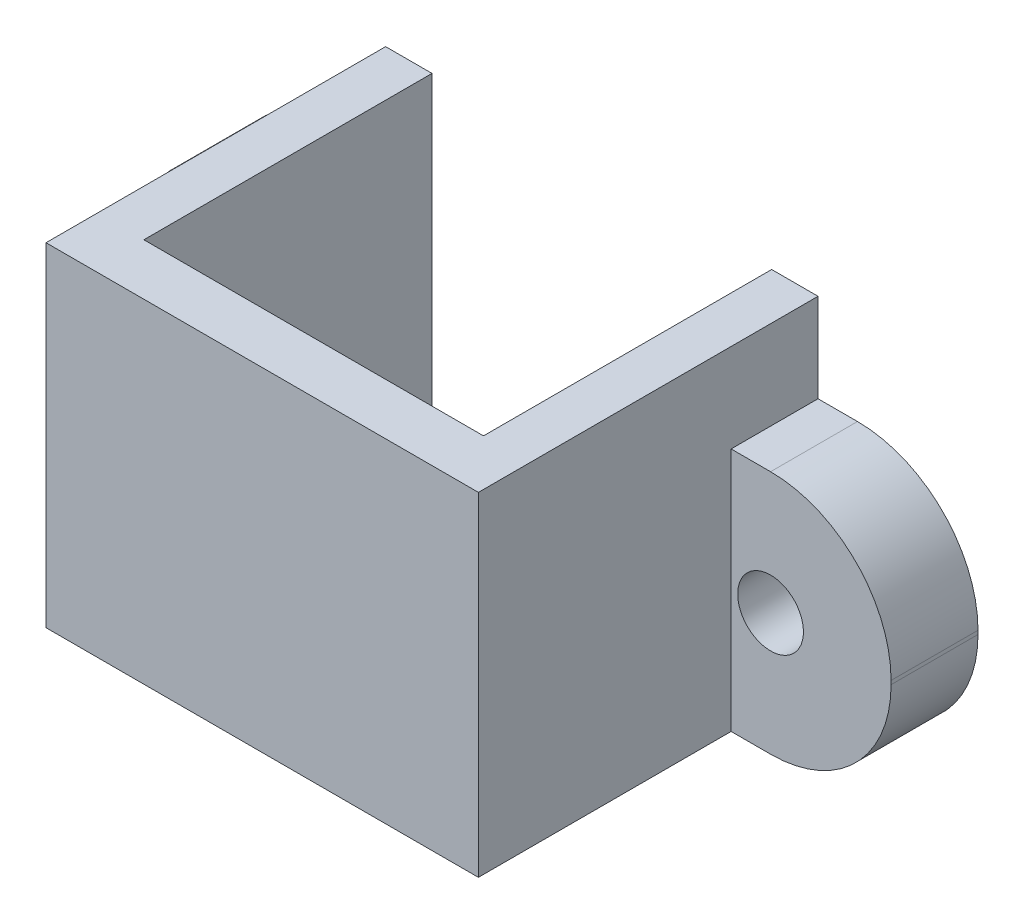
ISO-10303-21;
HEADER;
FILE_DESCRIPTION(('STEP AP214'),'2;1');
FILE_NAME('part.step','',(''),(''),'','','');
FILE_SCHEMA(('AUTOMOTIVE_DESIGN { 1 0 10303 214 1 1 1 1 }'));
ENDSEC;
DATA;
#1=APPLICATION_CONTEXT('core data for automotive mechanical design processes');
#2=APPLICATION_PROTOCOL_DEFINITION('international standard','automotive_design',2000,#1);
#3=PRODUCT_CONTEXT('',#1,'mechanical');
#4=PRODUCT('Part','Part','',(#3));
#5=PRODUCT_RELATED_PRODUCT_CATEGORY('part','',(#4));
#6=PRODUCT_DEFINITION_FORMATION('','',#4);
#7=PRODUCT_DEFINITION_CONTEXT('part definition',#1,'design');
#8=PRODUCT_DEFINITION('design','',#6,#7);
#9=PRODUCT_DEFINITION_SHAPE('','',#8);
#10=(LENGTH_UNIT() NAMED_UNIT(*) SI_UNIT(.MILLI.,.METRE.));
#11=(NAMED_UNIT(*) PLANE_ANGLE_UNIT() SI_UNIT($,.RADIAN.));
#12=(NAMED_UNIT(*) SI_UNIT($,.STERADIAN.) SOLID_ANGLE_UNIT());
#13=UNCERTAINTY_MEASURE_WITH_UNIT(LENGTH_MEASURE(1.E-05),#10,'distance_accuracy_value','');
#14=(GEOMETRIC_REPRESENTATION_CONTEXT(3) GLOBAL_UNCERTAINTY_ASSIGNED_CONTEXT((#13)) GLOBAL_UNIT_ASSIGNED_CONTEXT((#10,
#11,#12)) REPRESENTATION_CONTEXT('',''));
#15=CARTESIAN_POINT('',(0.,0.,0.));
#16=DIRECTION('',(0.,0.,1.));
#17=DIRECTION('',(1.,0.,0.));
#18=AXIS2_PLACEMENT_3D('',#15,#16,#17);
#19=CARTESIAN_POINT('',(26.162,11.5951,3.0226));
#20=DIRECTION('',(0.,0.,-1.));
#21=DIRECTION('',(-1.,0.,0.));
#22=AXIS2_PLACEMENT_3D('',#19,#20,#21);
#23=PLANE('',#22);
#24=CARTESIAN_POINT('',(21.971,4.2545,3.0226));
#25=DIRECTION('',(0.,0.,1.));
#26=DIRECTION('',(1.,0.,0.));
#27=AXIS2_PLACEMENT_3D('',#24,#25,#26);
#28=CIRCLE('',#27,1.143);
#29=CARTESIAN_POINT('',(23.114,4.2545,3.0226));
#30=VERTEX_POINT('',#29);
#31=EDGE_CURVE('E337',#30,#30,#28,.T.);
#32=ORIENTED_EDGE('',*,*,#31,.F.);
#33=EDGE_LOOP('',(#32));
#34=FACE_BOUND('',#33,.T.);
#35=DIRECTION('',(1.,0.,0.));
#36=VECTOR('',#35,1.);
#37=CARTESIAN_POINT('',(26.162,0.,3.0226));
#38=LINE('',#37,#36);
#39=CARTESIAN_POINT('',(20.5994,0.,3.0226));
#40=VERTEX_POINT('',#39);
#41=CARTESIAN_POINT('',(21.971,0.,3.0226));
#42=VERTEX_POINT('',#41);
#43=EDGE_CURVE('E222',#40,#42,#38,.T.);
#44=ORIENTED_EDGE('',*,*,#43,.T.);
#45=CARTESIAN_POINT('',(21.971,4.191,3.0226));
#46=DIRECTION('',(0.,0.,-1.));
#47=DIRECTION('',(-1.,0.,0.));
#48=AXIS2_PLACEMENT_3D('',#45,#46,#47);
#49=CIRCLE('',#48,4.191);
#50=CARTESIAN_POINT('',(26.162,4.19100000000003,3.0226));
#51=VERTEX_POINT('',#50);
#52=EDGE_CURVE('E48',#42,#51,#49,.F.);
#53=ORIENTED_EDGE('',*,*,#52,.T.);
#54=DIRECTION('',(0.,-1.,0.));
#55=VECTOR('',#54,1.);
#56=CARTESIAN_POINT('',(26.162,11.5951,3.0226));
#57=LINE('',#56,#55);
#58=CARTESIAN_POINT('',(26.162,4.31799999999997,3.0226));
#59=VERTEX_POINT('',#58);
#60=EDGE_CURVE('E173',#59,#51,#57,.T.);
#61=ORIENTED_EDGE('',*,*,#60,.F.);
#62=CARTESIAN_POINT('',(21.971,4.318,3.0226));
#63=DIRECTION('',(0.,0.,-1.));
#64=DIRECTION('',(-1.,0.,0.));
#65=AXIS2_PLACEMENT_3D('',#62,#63,#64);
#66=CIRCLE('',#65,4.191);
#67=CARTESIAN_POINT('',(21.971,8.509,3.0226));
#68=VERTEX_POINT('',#67);
#69=EDGE_CURVE('E314',#59,#68,#66,.F.);
#70=ORIENTED_EDGE('',*,*,#69,.T.);
#71=DIRECTION('',(-1.,0.,0.));
#72=VECTOR('',#71,1.);
#73=CARTESIAN_POINT('',(26.162,8.509,3.0226));
#74=LINE('',#73,#72);
#75=CARTESIAN_POINT('',(20.5994,8.509,3.0226));
#76=VERTEX_POINT('',#75);
#77=EDGE_CURVE('E311',#68,#76,#74,.T.);
#78=ORIENTED_EDGE('',*,*,#77,.T.);
#79=DIRECTION('',(0.,-1.,0.));
#80=VECTOR('',#79,1.);
#81=CARTESIAN_POINT('',(20.5994,11.5951,3.0226));
#82=LINE('',#81,#80);
#83=EDGE_CURVE('E180',#76,#40,#82,.T.);
#84=ORIENTED_EDGE('',*,*,#83,.T.);
#85=EDGE_LOOP('',(#44,#53,#61,#70,#78,#84));
#86=FACE_BOUND('',#85,.T.);
#87=ADVANCED_FACE('F33',(#34,#86),#23,.F.);
#88=CARTESIAN_POINT('',(18.9865,11.5951,0.));
#89=DIRECTION('',(0.,0.,1.));
#90=DIRECTION('',(1.,0.,0.));
#91=AXIS2_PLACEMENT_3D('',#88,#89,#90);
#92=PLANE('',#91);
#93=CARTESIAN_POINT('',(21.971,4.2545,0.));
#94=DIRECTION('',(0.,0.,1.));
#95=DIRECTION('',(1.,0.,0.));
#96=AXIS2_PLACEMENT_3D('',#93,#94,#95);
#97=CIRCLE('',#96,1.143);
#98=CARTESIAN_POINT('',(23.114,4.2545,0.));
#99=VERTEX_POINT('',#98);
#100=EDGE_CURVE('E334',#99,#99,#97,.T.);
#101=ORIENTED_EDGE('',*,*,#100,.T.);
#102=EDGE_LOOP('',(#101));
#103=FACE_BOUND('',#102,.T.);
#104=DIRECTION('',(0.,-1.,0.));
#105=VECTOR('',#104,1.);
#106=CARTESIAN_POINT('',(26.162,11.5951,0.));
#107=LINE('',#106,#105);
#108=CARTESIAN_POINT('',(26.162,4.318,0.));
#109=VERTEX_POINT('',#108);
#110=CARTESIAN_POINT('',(26.162,4.19100000000003,0.));
#111=VERTEX_POINT('',#110);
#112=EDGE_CURVE('E171',#109,#111,#107,.T.);
#113=ORIENTED_EDGE('',*,*,#112,.T.);
#114=CARTESIAN_POINT('',(21.971,4.191,0.));
#115=DIRECTION('',(0.,0.,1.));
#116=DIRECTION('',(1.,0.,0.));
#117=AXIS2_PLACEMENT_3D('',#114,#115,#116);
#118=CIRCLE('',#117,4.191);
#119=CARTESIAN_POINT('',(21.971,0.,0.));
#120=VERTEX_POINT('',#119);
#121=EDGE_CURVE('E157',#111,#120,#118,.F.);
#122=ORIENTED_EDGE('',*,*,#121,.T.);
#123=DIRECTION('',(-1.,0.,0.));
#124=VECTOR('',#123,1.);
#125=CARTESIAN_POINT('',(18.9865,0.,0.));
#126=LINE('',#125,#124);
#127=CARTESIAN_POINT('',(18.9865,0.,0.));
#128=VERTEX_POINT('',#127);
#129=EDGE_CURVE('E225',#120,#128,#126,.T.);
#130=ORIENTED_EDGE('',*,*,#129,.T.);
#131=DIRECTION('',(0.,-1.,0.));
#132=VECTOR('',#131,1.);
#133=CARTESIAN_POINT('',(18.9865,11.5951,0.));
#134=LINE('',#133,#132);
#135=CARTESIAN_POINT('',(18.9865,11.5951,0.));
#136=VERTEX_POINT('',#135);
#137=EDGE_CURVE('E178',#136,#128,#134,.T.);
#138=ORIENTED_EDGE('',*,*,#137,.F.);
#139=DIRECTION('',(-1.,0.,0.));
#140=VECTOR('',#139,1.);
#141=CARTESIAN_POINT('',(18.9865,11.5951,0.));
#142=LINE('',#141,#140);
#143=CARTESIAN_POINT('',(20.5994,11.5951,0.));
#144=VERTEX_POINT('',#143);
#145=EDGE_CURVE('E278',#144,#136,#142,.T.);
#146=ORIENTED_EDGE('',*,*,#145,.F.);
#147=DIRECTION('',(0.,1.,0.));
#148=VECTOR('',#147,1.);
#149=CARTESIAN_POINT('',(20.5994,0.,0.));
#150=LINE('',#149,#148);
#151=CARTESIAN_POINT('',(20.5994,8.509,0.));
#152=VERTEX_POINT('',#151);
#153=EDGE_CURVE('E321',#152,#144,#150,.T.);
#154=ORIENTED_EDGE('',*,*,#153,.F.);
#155=DIRECTION('',(1.,0.,0.));
#156=VECTOR('',#155,1.);
#157=CARTESIAN_POINT('',(0.,8.509,0.));
#158=LINE('',#157,#156);
#159=CARTESIAN_POINT('',(21.971,8.509,0.));
#160=VERTEX_POINT('',#159);
#161=EDGE_CURVE('E327',#152,#160,#158,.T.);
#162=ORIENTED_EDGE('',*,*,#161,.T.);
#163=CARTESIAN_POINT('',(21.971,4.318,0.));
#164=DIRECTION('',(0.,0.,1.));
#165=DIRECTION('',(1.,0.,0.));
#166=AXIS2_PLACEMENT_3D('',#163,#164,#165);
#167=CIRCLE('',#166,4.191);
#168=EDGE_CURVE('E177',#160,#109,#167,.F.);
#169=ORIENTED_EDGE('',*,*,#168,.T.);
#170=EDGE_LOOP('',(#113,#122,#130,#138,#146,#154,#162,#169));
#171=FACE_BOUND('',#170,.T.);
#172=ADVANCED_FACE('F175',(#103,#171),#92,.F.);
#173=CARTESIAN_POINT('',(0.,0.,0.));
#174=DIRECTION('',(0.,1.,0.));
#175=DIRECTION('',(0.,0.,1.));
#176=AXIS2_PLACEMENT_3D('',#173,#174,#175);
#177=PLANE('',#176);
#178=DIRECTION('',(0.,0.,1.));
#179=VECTOR('',#178,1.);
#180=CARTESIAN_POINT('',(21.971,0.,0.));
#181=LINE('',#180,#179);
#182=EDGE_CURVE('E161',#120,#42,#181,.T.);
#183=ORIENTED_EDGE('',*,*,#182,.T.);
#184=ORIENTED_EDGE('',*,*,#43,.F.);
#185=DIRECTION('',(0.,0.,-1.));
#186=VECTOR('',#185,1.);
#187=CARTESIAN_POINT('',(20.5994,0.,11.811));
#188=LINE('',#187,#186);
#189=CARTESIAN_POINT('',(20.5994,0.,11.811));
#190=VERTEX_POINT('',#189);
#191=EDGE_CURVE('E214',#190,#40,#188,.T.);
#192=ORIENTED_EDGE('',*,*,#191,.F.);
#193=DIRECTION('',(1.,0.,0.));
#194=VECTOR('',#193,1.);
#195=CARTESIAN_POINT('',(5.5626,0.,11.811));
#196=LINE('',#195,#194);
#197=CARTESIAN_POINT('',(5.5626,0.,11.811));
#198=VERTEX_POINT('',#197);
#199=EDGE_CURVE('E212',#198,#190,#196,.T.);
#200=ORIENTED_EDGE('',*,*,#199,.F.);
#201=DIRECTION('',(0.,0.,1.));
#202=VECTOR('',#201,1.);
#203=CARTESIAN_POINT('',(5.5626,0.,3.0226));
#204=LINE('',#203,#202);
#205=CARTESIAN_POINT('',(5.5626,0.,3.0226));
#206=VERTEX_POINT('',#205);
#207=EDGE_CURVE('E199',#206,#198,#204,.T.);
#208=ORIENTED_EDGE('',*,*,#207,.F.);
#209=DIRECTION('',(1.,0.,0.));
#210=VECTOR('',#209,1.);
#211=CARTESIAN_POINT('',(0.,0.,3.02260000000001));
#212=LINE('',#211,#210);
#213=CARTESIAN_POINT('',(4.19100000000003,0.,3.02260000000001));
#214=VERTEX_POINT('',#213);
#215=EDGE_CURVE('E209',#214,#206,#212,.T.);
#216=ORIENTED_EDGE('',*,*,#215,.F.);
#217=DIRECTION('',(0.,0.,1.));
#218=VECTOR('',#217,1.);
#219=CARTESIAN_POINT('',(4.19100000000003,0.,0.));
#220=LINE('',#219,#218);
#221=CARTESIAN_POINT('',(4.19100000000003,0.,0.));
#222=VERTEX_POINT('',#221);
#223=EDGE_CURVE('E305',#222,#214,#220,.T.);
#224=ORIENTED_EDGE('',*,*,#223,.F.);
#225=DIRECTION('',(-1.,0.,0.));
#226=VECTOR('',#225,1.);
#227=CARTESIAN_POINT('',(0.,0.,0.));
#228=LINE('',#227,#226);
#229=CARTESIAN_POINT('',(7.1755,0.,0.));
#230=VERTEX_POINT('',#229);
#231=EDGE_CURVE('E233',#230,#222,#228,.T.);
#232=ORIENTED_EDGE('',*,*,#231,.F.);
#233=DIRECTION('',(0.,0.,-1.));
#234=VECTOR('',#233,1.);
#235=CARTESIAN_POINT('',(7.1755,0.,0.));
#236=LINE('',#235,#234);
#237=CARTESIAN_POINT('',(7.1755,0.,10.0203));
#238=VERTEX_POINT('',#237);
#239=EDGE_CURVE('E231',#238,#230,#236,.T.);
#240=ORIENTED_EDGE('',*,*,#239,.F.);
#241=DIRECTION('',(-1.,0.,0.));
#242=VECTOR('',#241,1.);
#243=CARTESIAN_POINT('',(7.1755,0.,10.0203));
#244=LINE('',#243,#242);
#245=CARTESIAN_POINT('',(18.9865,0.,10.0203));
#246=VERTEX_POINT('',#245);
#247=EDGE_CURVE('E229',#246,#238,#244,.T.);
#248=ORIENTED_EDGE('',*,*,#247,.F.);
#249=DIRECTION('',(0.,0.,1.));
#250=VECTOR('',#249,1.);
#251=CARTESIAN_POINT('',(18.9865,0.,10.0203));
#252=LINE('',#251,#250);
#253=EDGE_CURVE('E227',#128,#246,#252,.T.);
#254=ORIENTED_EDGE('',*,*,#253,.F.);
#255=ORIENTED_EDGE('',*,*,#129,.F.);
#256=EDGE_LOOP('',(#183,#184,#192,#200,#208,#216,#224,#232,#240,#248,#254,#255));
#257=FACE_BOUND('',#256,.T.);
#258=ADVANCED_FACE('F207',(#257),#177,.F.);
#259=CARTESIAN_POINT('',(0.,11.5951,0.));
#260=DIRECTION('',(0.,1.,0.));
#261=DIRECTION('',(0.,0.,1.));
#262=AXIS2_PLACEMENT_3D('',#259,#260,#261);
#263=PLANE('',#262);
#264=DIRECTION('',(0.,0.,-1.));
#265=VECTOR('',#264,1.);
#266=CARTESIAN_POINT('',(20.5994,11.5951,11.811));
#267=LINE('',#266,#265);
#268=CARTESIAN_POINT('',(20.5994,11.5951,11.811));
#269=VERTEX_POINT('',#268);
#270=EDGE_CURVE('E280',#269,#144,#267,.T.);
#271=ORIENTED_EDGE('',*,*,#270,.T.);
#272=ORIENTED_EDGE('',*,*,#145,.T.);
#273=DIRECTION('',(0.,0.,1.));
#274=VECTOR('',#273,1.);
#275=CARTESIAN_POINT('',(18.9865,11.5951,10.0203));
#276=LINE('',#275,#274);
#277=CARTESIAN_POINT('',(18.9865,11.5951,10.0203));
#278=VERTEX_POINT('',#277);
#279=EDGE_CURVE('E276',#136,#278,#276,.T.);
#280=ORIENTED_EDGE('',*,*,#279,.T.);
#281=DIRECTION('',(-1.,0.,0.));
#282=VECTOR('',#281,1.);
#283=CARTESIAN_POINT('',(7.1755,11.5951,10.0203));
#284=LINE('',#283,#282);
#285=CARTESIAN_POINT('',(7.1755,11.5951,10.0203));
#286=VERTEX_POINT('',#285);
#287=EDGE_CURVE('E253',#278,#286,#284,.T.);
#288=ORIENTED_EDGE('',*,*,#287,.T.);
#289=DIRECTION('',(0.,0.,-1.));
#290=VECTOR('',#289,1.);
#291=CARTESIAN_POINT('',(7.1755,11.5951,0.));
#292=LINE('',#291,#290);
#293=CARTESIAN_POINT('',(7.1755,11.5951,0.));
#294=VERTEX_POINT('',#293);
#295=EDGE_CURVE('E272',#286,#294,#292,.T.);
#296=ORIENTED_EDGE('',*,*,#295,.T.);
#297=DIRECTION('',(-1.,0.,0.));
#298=VECTOR('',#297,1.);
#299=CARTESIAN_POINT('',(0.,11.5951,0.));
#300=LINE('',#299,#298);
#301=CARTESIAN_POINT('',(5.5626,11.5951,0.));
#302=VERTEX_POINT('',#301);
#303=EDGE_CURVE('E241',#294,#302,#300,.T.);
#304=ORIENTED_EDGE('',*,*,#303,.T.);
#305=DIRECTION('',(0.,0.,1.));
#306=VECTOR('',#305,1.);
#307=CARTESIAN_POINT('',(5.5626,11.5951,3.0226));
#308=LINE('',#307,#306);
#309=CARTESIAN_POINT('',(5.5626,11.5951,11.811));
#310=VERTEX_POINT('',#309);
#311=EDGE_CURVE('E236',#302,#310,#308,.T.);
#312=ORIENTED_EDGE('',*,*,#311,.T.);
#313=DIRECTION('',(1.,0.,0.));
#314=VECTOR('',#313,1.);
#315=CARTESIAN_POINT('',(5.5626,11.5951,11.811));
#316=LINE('',#315,#314);
#317=EDGE_CURVE('E282',#310,#269,#316,.T.);
#318=ORIENTED_EDGE('',*,*,#317,.T.);
#319=EDGE_LOOP('',(#271,#272,#280,#288,#296,#304,#312,#318));
#320=FACE_BOUND('',#319,.T.);
#321=ADVANCED_FACE('F359',(#320),#263,.T.);
#322=CARTESIAN_POINT('',(26.162,11.5951,0.));
#323=DIRECTION('',(-1.,0.,0.));
#324=DIRECTION('',(0.,0.,1.));
#325=AXIS2_PLACEMENT_3D('',#322,#323,#324);
#326=PLANE('',#325);
#327=ORIENTED_EDGE('',*,*,#60,.T.);
#328=DIRECTION('',(0.,0.,1.));
#329=VECTOR('',#328,1.);
#330=CARTESIAN_POINT('',(26.162,4.19100000000003,0.));
#331=LINE('',#330,#329);
#332=EDGE_CURVE('E160',#111,#51,#331,.T.);
#333=ORIENTED_EDGE('',*,*,#332,.F.);
#334=ORIENTED_EDGE('',*,*,#112,.F.);
#335=DIRECTION('',(0.,0.,1.));
#336=VECTOR('',#335,1.);
#337=CARTESIAN_POINT('',(26.162,4.31799999999997,0.));
#338=LINE('',#337,#336);
#339=EDGE_CURVE('E56',#109,#59,#338,.T.);
#340=ORIENTED_EDGE('',*,*,#339,.T.);
#341=EDGE_LOOP('',(#327,#333,#334,#340));
#342=FACE_BOUND('',#341,.T.);
#343=ADVANCED_FACE('F170',(#342),#326,.F.);
#344=CARTESIAN_POINT('',(0.,11.5951,3.02260000000001));
#345=DIRECTION('',(0.,0.,-1.));
#346=DIRECTION('',(-1.,0.,0.));
#347=AXIS2_PLACEMENT_3D('',#344,#345,#346);
#348=PLANE('',#347);
#349=CARTESIAN_POINT('',(4.19100000000004,4.2545,3.0226));
#350=DIRECTION('',(0.,0.,1.));
#351=DIRECTION('',(1.,0.,0.));
#352=AXIS2_PLACEMENT_3D('',#349,#350,#351);
#353=CIRCLE('',#352,1.143);
#354=CARTESIAN_POINT('',(5.33400000000004,4.2545,3.0226));
#355=VERTEX_POINT('',#354);
#356=EDGE_CURVE('E331',#355,#355,#353,.T.);
#357=ORIENTED_EDGE('',*,*,#356,.F.);
#358=EDGE_LOOP('',(#357));
#359=FACE_BOUND('',#358,.T.);
#360=DIRECTION('',(0.,-1.,0.));
#361=VECTOR('',#360,1.);
#362=CARTESIAN_POINT('',(0.,11.5951,3.02260000000001));
#363=LINE('',#362,#361);
#364=CARTESIAN_POINT('',(0.,4.31799999999997,3.02260000000001));
#365=VERTEX_POINT('',#364);
#366=CARTESIAN_POINT('',(0.,4.19100000000003,3.02260000000001));
#367=VERTEX_POINT('',#366);
#368=EDGE_CURVE('E11',#365,#367,#363,.T.);
#369=ORIENTED_EDGE('',*,*,#368,.T.);
#370=CARTESIAN_POINT('',(4.191,4.191,3.02260000000001));
#371=DIRECTION('',(0.,0.,-1.));
#372=DIRECTION('',(-1.,0.,0.));
#373=AXIS2_PLACEMENT_3D('',#370,#371,#372);
#374=CIRCLE('',#373,4.191);
#375=EDGE_CURVE('E301',#367,#214,#374,.F.);
#376=ORIENTED_EDGE('',*,*,#375,.T.);
#377=ORIENTED_EDGE('',*,*,#215,.T.);
#378=DIRECTION('',(0.,-1.,0.));
#379=VECTOR('',#378,1.);
#380=CARTESIAN_POINT('',(5.5626,11.5951,3.0226));
#381=LINE('',#380,#379);
#382=CARTESIAN_POINT('',(5.5626,8.509,3.0226));
#383=VERTEX_POINT('',#382);
#384=EDGE_CURVE('E41',#383,#206,#381,.T.);
#385=ORIENTED_EDGE('',*,*,#384,.F.);
#386=DIRECTION('',(-1.,0.,0.));
#387=VECTOR('',#386,1.);
#388=CARTESIAN_POINT('',(0.,8.509,3.02260000000001));
#389=LINE('',#388,#387);
#390=CARTESIAN_POINT('',(4.19100000000003,8.509,3.02260000000001));
#391=VERTEX_POINT('',#390);
#392=EDGE_CURVE('E216',#383,#391,#389,.T.);
#393=ORIENTED_EDGE('',*,*,#392,.T.);
#394=CARTESIAN_POINT('',(4.191,4.318,3.02260000000001));
#395=DIRECTION('',(0.,0.,-1.));
#396=DIRECTION('',(-1.,0.,0.));
#397=AXIS2_PLACEMENT_3D('',#394,#395,#396);
#398=CIRCLE('',#397,4.191);
#399=EDGE_CURVE('E286',#391,#365,#398,.F.);
#400=ORIENTED_EDGE('',*,*,#399,.T.);
#401=EDGE_LOOP('',(#369,#376,#377,#385,#393,#400));
#402=FACE_BOUND('',#401,.T.);
#403=ADVANCED_FACE('F406',(#359,#402),#348,.F.);
#404=CARTESIAN_POINT('',(0.,11.5951,0.));
#405=DIRECTION('',(1.,0.,0.));
#406=DIRECTION('',(0.,0.,-1.));
#407=AXIS2_PLACEMENT_3D('',#404,#405,#406);
#408=PLANE('',#407);
#409=DIRECTION('',(0.,0.,1.));
#410=VECTOR('',#409,1.);
#411=CARTESIAN_POINT('',(0.,4.19100000000003,0.));
#412=LINE('',#411,#410);
#413=CARTESIAN_POINT('',(0.,4.19100000000003,0.));
#414=VERTEX_POINT('',#413);
#415=EDGE_CURVE('E304',#414,#367,#412,.T.);
#416=ORIENTED_EDGE('',*,*,#415,.T.);
#417=ORIENTED_EDGE('',*,*,#368,.F.);
#418=DIRECTION('',(0.,0.,1.));
#419=VECTOR('',#418,1.);
#420=CARTESIAN_POINT('',(0.,4.31799999999997,0.));
#421=LINE('',#420,#419);
#422=CARTESIAN_POINT('',(0.,4.31799999999997,0.));
#423=VERTEX_POINT('',#422);
#424=EDGE_CURVE('E289',#423,#365,#421,.T.);
#425=ORIENTED_EDGE('',*,*,#424,.F.);
#426=DIRECTION('',(0.,-1.,0.));
#427=VECTOR('',#426,1.);
#428=CARTESIAN_POINT('',(0.,11.5951,0.));
#429=LINE('',#428,#427);
#430=EDGE_CURVE('E237',#423,#414,#429,.T.);
#431=ORIENTED_EDGE('',*,*,#430,.T.);
#432=EDGE_LOOP('',(#416,#417,#425,#431));
#433=FACE_BOUND('',#432,.T.);
#434=ADVANCED_FACE('F35',(#433),#408,.F.);
#435=CARTESIAN_POINT('',(0.,11.5951,0.));
#436=DIRECTION('',(0.,0.,1.));
#437=DIRECTION('',(1.,0.,0.));
#438=AXIS2_PLACEMENT_3D('',#435,#436,#437);
#439=PLANE('',#438);
#440=CARTESIAN_POINT('',(4.19100000000004,4.2545,0.));
#441=DIRECTION('',(0.,0.,1.));
#442=DIRECTION('',(1.,0.,0.));
#443=AXIS2_PLACEMENT_3D('',#440,#441,#442);
#444=CIRCLE('',#443,1.143);
#445=CARTESIAN_POINT('',(5.33400000000004,4.2545,0.));
#446=VERTEX_POINT('',#445);
#447=EDGE_CURVE('E165',#446,#446,#444,.T.);
#448=ORIENTED_EDGE('',*,*,#447,.T.);
#449=EDGE_LOOP('',(#448));
#450=FACE_BOUND('',#449,.T.);
#451=ORIENTED_EDGE('',*,*,#231,.T.);
#452=CARTESIAN_POINT('',(4.191,4.191,0.));
#453=DIRECTION('',(0.,0.,1.));
#454=DIRECTION('',(1.,0.,0.));
#455=AXIS2_PLACEMENT_3D('',#452,#453,#454);
#456=CIRCLE('',#455,4.191);
#457=EDGE_CURVE('E307',#222,#414,#456,.F.);
#458=ORIENTED_EDGE('',*,*,#457,.T.);
#459=ORIENTED_EDGE('',*,*,#430,.F.);
#460=CARTESIAN_POINT('',(4.191,4.318,0.));
#461=DIRECTION('',(0.,0.,1.));
#462=DIRECTION('',(1.,0.,0.));
#463=AXIS2_PLACEMENT_3D('',#460,#461,#462);
#464=CIRCLE('',#463,4.191);
#465=CARTESIAN_POINT('',(4.19100000000003,8.509,0.));
#466=VERTEX_POINT('',#465);
#467=EDGE_CURVE('E298',#423,#466,#464,.F.);
#468=ORIENTED_EDGE('',*,*,#467,.T.);
#469=DIRECTION('',(1.,0.,0.));
#470=VECTOR('',#469,1.);
#471=CARTESIAN_POINT('',(0.,8.509,0.));
#472=LINE('',#471,#470);
#473=CARTESIAN_POINT('',(5.5626,8.509,0.));
#474=VERTEX_POINT('',#473);
#475=EDGE_CURVE('E296',#466,#474,#472,.T.);
#476=ORIENTED_EDGE('',*,*,#475,.T.);
#477=DIRECTION('',(0.,-1.,0.));
#478=VECTOR('',#477,1.);
#479=CARTESIAN_POINT('',(5.5626,0.,0.));
#480=LINE('',#479,#478);
#481=EDGE_CURVE('E270',#302,#474,#480,.T.);
#482=ORIENTED_EDGE('',*,*,#481,.F.);
#483=ORIENTED_EDGE('',*,*,#303,.F.);
#484=DIRECTION('',(0.,-1.,0.));
#485=VECTOR('',#484,1.);
#486=CARTESIAN_POINT('',(7.1755,11.5951,0.));
#487=LINE('',#486,#485);
#488=EDGE_CURVE('E240',#294,#230,#487,.T.);
#489=ORIENTED_EDGE('',*,*,#488,.T.);
#490=EDGE_LOOP('',(#451,#458,#459,#468,#476,#482,#483,#489));
#491=FACE_BOUND('',#490,.T.);
#492=ADVANCED_FACE('F265',(#450,#491),#439,.F.);
#493=CARTESIAN_POINT('',(5.5626,11.5951,3.0226));
#494=DIRECTION('',(1.,0.,0.));
#495=DIRECTION('',(0.,0.,-1.));
#496=AXIS2_PLACEMENT_3D('',#493,#494,#495);
#497=PLANE('',#496);
#498=ORIENTED_EDGE('',*,*,#207,.T.);
#499=DIRECTION('',(0.,-1.,0.));
#500=VECTOR('',#499,1.);
#501=CARTESIAN_POINT('',(5.5626,11.5951,11.811));
#502=LINE('',#501,#500);
#503=EDGE_CURVE('E190',#310,#198,#502,.T.);
#504=ORIENTED_EDGE('',*,*,#503,.F.);
#505=ORIENTED_EDGE('',*,*,#311,.F.);
#506=ORIENTED_EDGE('',*,*,#481,.T.);
#507=DIRECTION('',(0.,0.,1.));
#508=VECTOR('',#507,1.);
#509=CARTESIAN_POINT('',(5.5626,8.509,0.));
#510=LINE('',#509,#508);
#511=EDGE_CURVE('E202',#474,#383,#510,.T.);
#512=ORIENTED_EDGE('',*,*,#511,.T.);
#513=ORIENTED_EDGE('',*,*,#384,.T.);
#514=EDGE_LOOP('',(#498,#504,#505,#506,#512,#513));
#515=FACE_BOUND('',#514,.T.);
#516=ADVANCED_FACE('F197',(#515),#497,.F.);
#517=CARTESIAN_POINT('',(5.5626,11.5951,11.811));
#518=DIRECTION('',(0.,0.,-1.));
#519=DIRECTION('',(-1.,0.,0.));
#520=AXIS2_PLACEMENT_3D('',#517,#518,#519);
#521=PLANE('',#520);
#522=ORIENTED_EDGE('',*,*,#199,.T.);
#523=DIRECTION('',(0.,-1.,0.));
#524=VECTOR('',#523,1.);
#525=CARTESIAN_POINT('',(20.5994,11.5951,11.811));
#526=LINE('',#525,#524);
#527=EDGE_CURVE('E188',#269,#190,#526,.T.);
#528=ORIENTED_EDGE('',*,*,#527,.F.);
#529=ORIENTED_EDGE('',*,*,#317,.F.);
#530=ORIENTED_EDGE('',*,*,#503,.T.);
#531=EDGE_LOOP('',(#522,#528,#529,#530));
#532=FACE_BOUND('',#531,.T.);
#533=ADVANCED_FACE('F410',(#532),#521,.F.);
#534=CARTESIAN_POINT('',(20.5994,11.5951,11.811));
#535=DIRECTION('',(-1.,0.,0.));
#536=DIRECTION('',(0.,0.,1.));
#537=AXIS2_PLACEMENT_3D('',#534,#535,#536);
#538=PLANE('',#537);
#539=ORIENTED_EDGE('',*,*,#83,.F.);
#540=DIRECTION('',(0.,0.,1.));
#541=VECTOR('',#540,1.);
#542=CARTESIAN_POINT('',(20.5994,8.509,0.));
#543=LINE('',#542,#541);
#544=EDGE_CURVE('E317',#152,#76,#543,.T.);
#545=ORIENTED_EDGE('',*,*,#544,.F.);
#546=ORIENTED_EDGE('',*,*,#153,.T.);
#547=ORIENTED_EDGE('',*,*,#270,.F.);
#548=ORIENTED_EDGE('',*,*,#527,.T.);
#549=ORIENTED_EDGE('',*,*,#191,.T.);
#550=EDGE_LOOP('',(#539,#545,#546,#547,#548,#549));
#551=FACE_BOUND('',#550,.T.);
#552=ADVANCED_FACE('F364',(#551),#538,.F.);
#553=CARTESIAN_POINT('',(18.9865,11.5951,10.0203));
#554=DIRECTION('',(1.,0.,0.));
#555=DIRECTION('',(0.,0.,-1.));
#556=AXIS2_PLACEMENT_3D('',#553,#554,#555);
#557=PLANE('',#556);
#558=ORIENTED_EDGE('',*,*,#253,.T.);
#559=DIRECTION('',(0.,-1.,0.));
#560=VECTOR('',#559,1.);
#561=CARTESIAN_POINT('',(18.9865,11.5951,10.0203));
#562=LINE('',#561,#560);
#563=EDGE_CURVE('E183',#278,#246,#562,.T.);
#564=ORIENTED_EDGE('',*,*,#563,.F.);
#565=ORIENTED_EDGE('',*,*,#279,.F.);
#566=ORIENTED_EDGE('',*,*,#137,.T.);
#567=EDGE_LOOP('',(#558,#564,#565,#566));
#568=FACE_BOUND('',#567,.T.);
#569=ADVANCED_FACE('F358',(#568),#557,.F.);
#570=CARTESIAN_POINT('',(7.1755,11.5951,10.0203));
#571=DIRECTION('',(0.,0.,1.));
#572=DIRECTION('',(1.,0.,0.));
#573=AXIS2_PLACEMENT_3D('',#570,#571,#572);
#574=PLANE('',#573);
#575=ORIENTED_EDGE('',*,*,#247,.T.);
#576=DIRECTION('',(0.,-1.,0.));
#577=VECTOR('',#576,1.);
#578=CARTESIAN_POINT('',(7.1755,11.5951,10.0203));
#579=LINE('',#578,#577);
#580=EDGE_CURVE('E244',#286,#238,#579,.T.);
#581=ORIENTED_EDGE('',*,*,#580,.F.);
#582=ORIENTED_EDGE('',*,*,#287,.F.);
#583=ORIENTED_EDGE('',*,*,#563,.T.);
#584=EDGE_LOOP('',(#575,#581,#582,#583));
#585=FACE_BOUND('',#584,.T.);
#586=ADVANCED_FACE('F251',(#585),#574,.F.);
#587=CARTESIAN_POINT('',(7.1755,11.5951,0.));
#588=DIRECTION('',(-1.,0.,0.));
#589=DIRECTION('',(0.,0.,1.));
#590=AXIS2_PLACEMENT_3D('',#587,#588,#589);
#591=PLANE('',#590);
#592=ORIENTED_EDGE('',*,*,#239,.T.);
#593=ORIENTED_EDGE('',*,*,#488,.F.);
#594=ORIENTED_EDGE('',*,*,#295,.F.);
#595=ORIENTED_EDGE('',*,*,#580,.T.);
#596=EDGE_LOOP('',(#592,#593,#594,#595));
#597=FACE_BOUND('',#596,.T.);
#598=ADVANCED_FACE('F261',(#597),#591,.F.);
#599=CARTESIAN_POINT('',(0.,8.509,0.));
#600=DIRECTION('',(0.,-1.,0.));
#601=DIRECTION('',(0.,0.,-1.));
#602=AXIS2_PLACEMENT_3D('',#599,#600,#601);
#603=PLANE('',#602);
#604=ORIENTED_EDGE('',*,*,#511,.F.);
#605=ORIENTED_EDGE('',*,*,#475,.F.);
#606=DIRECTION('',(0.,0.,1.));
#607=VECTOR('',#606,1.);
#608=CARTESIAN_POINT('',(4.19100000000003,8.509,0.));
#609=LINE('',#608,#607);
#610=EDGE_CURVE('E291',#466,#391,#609,.T.);
#611=ORIENTED_EDGE('',*,*,#610,.T.);
#612=ORIENTED_EDGE('',*,*,#392,.F.);
#613=EDGE_LOOP('',(#604,#605,#611,#612));
#614=FACE_BOUND('',#613,.T.);
#615=ADVANCED_FACE('F383',(#614),#603,.F.);
#616=CARTESIAN_POINT('',(4.191,4.318,0.));
#617=DIRECTION('',(0.,0.,1.));
#618=DIRECTION('',(1.,0.,0.));
#619=AXIS2_PLACEMENT_3D('',#616,#617,#618);
#620=CYLINDRICAL_SURFACE('',#619,4.191);
#621=ORIENTED_EDGE('',*,*,#610,.F.);
#622=ORIENTED_EDGE('',*,*,#467,.F.);
#623=ORIENTED_EDGE('',*,*,#424,.T.);
#624=ORIENTED_EDGE('',*,*,#399,.F.);
#625=EDGE_LOOP('',(#621,#622,#623,#624));
#626=FACE_BOUND('',#625,.T.);
#627=ADVANCED_FACE('F381',(#626),#620,.T.);
#628=CARTESIAN_POINT('',(4.191,4.191,0.));
#629=DIRECTION('',(0.,0.,1.));
#630=DIRECTION('',(1.,0.,0.));
#631=AXIS2_PLACEMENT_3D('',#628,#629,#630);
#632=CYLINDRICAL_SURFACE('',#631,4.191);
#633=ORIENTED_EDGE('',*,*,#415,.F.);
#634=ORIENTED_EDGE('',*,*,#457,.F.);
#635=ORIENTED_EDGE('',*,*,#223,.T.);
#636=ORIENTED_EDGE('',*,*,#375,.F.);
#637=EDGE_LOOP('',(#633,#634,#635,#636));
#638=FACE_BOUND('',#637,.T.);
#639=ADVANCED_FACE('F375',(#638),#632,.T.);
#640=CARTESIAN_POINT('',(0.,8.509,0.));
#641=DIRECTION('',(0.,-1.,0.));
#642=DIRECTION('',(0.,0.,-1.));
#643=AXIS2_PLACEMENT_3D('',#640,#641,#642);
#644=PLANE('',#643);
#645=DIRECTION('',(0.,0.,1.));
#646=VECTOR('',#645,1.);
#647=CARTESIAN_POINT('',(21.971,8.509,0.));
#648=LINE('',#647,#646);
#649=EDGE_CURVE('E318',#160,#68,#648,.T.);
#650=ORIENTED_EDGE('',*,*,#649,.F.);
#651=ORIENTED_EDGE('',*,*,#161,.F.);
#652=ORIENTED_EDGE('',*,*,#544,.T.);
#653=ORIENTED_EDGE('',*,*,#77,.F.);
#654=EDGE_LOOP('',(#650,#651,#652,#653));
#655=FACE_BOUND('',#654,.T.);
#656=ADVANCED_FACE('F366',(#655),#644,.F.);
#657=CARTESIAN_POINT('',(21.971,4.318,0.));
#658=DIRECTION('',(0.,0.,1.));
#659=DIRECTION('',(1.,0.,0.));
#660=AXIS2_PLACEMENT_3D('',#657,#658,#659);
#661=CYLINDRICAL_SURFACE('',#660,4.191);
#662=ORIENTED_EDGE('',*,*,#339,.F.);
#663=ORIENTED_EDGE('',*,*,#168,.F.);
#664=ORIENTED_EDGE('',*,*,#649,.T.);
#665=ORIENTED_EDGE('',*,*,#69,.F.);
#666=EDGE_LOOP('',(#662,#663,#664,#665));
#667=FACE_BOUND('',#666,.T.);
#668=ADVANCED_FACE('F367',(#667),#661,.T.);
#669=CARTESIAN_POINT('',(21.971,4.191,0.));
#670=DIRECTION('',(0.,0.,1.));
#671=DIRECTION('',(1.,0.,0.));
#672=AXIS2_PLACEMENT_3D('',#669,#670,#671);
#673=CYLINDRICAL_SURFACE('',#672,4.191);
#674=ORIENTED_EDGE('',*,*,#182,.F.);
#675=ORIENTED_EDGE('',*,*,#121,.F.);
#676=ORIENTED_EDGE('',*,*,#332,.T.);
#677=ORIENTED_EDGE('',*,*,#52,.F.);
#678=EDGE_LOOP('',(#674,#675,#676,#677));
#679=FACE_BOUND('',#678,.T.);
#680=ADVANCED_FACE('F159',(#679),#673,.T.);
#681=CARTESIAN_POINT('',(4.19100000000004,4.2545,0.));
#682=DIRECTION('',(0.,0.,1.));
#683=DIRECTION('',(1.,0.,0.));
#684=AXIS2_PLACEMENT_3D('',#681,#682,#683);
#685=CYLINDRICAL_SURFACE('',#684,1.143);
#686=CARTESIAN_POINT('',(5.33400000000004,4.2545,0.));
#687=CARTESIAN_POINT('',(5.33400000000004,4.2545,0.0314854166666667));
#688=CARTESIAN_POINT('',(5.33400000000004,4.2545,0.0629708333333334));
#689=CARTESIAN_POINT('',(5.33400000000004,4.2545,0.125941666666667));
#690=CARTESIAN_POINT('',(5.33400000000004,4.2545,0.157427083333334));
#691=CARTESIAN_POINT('',(5.33400000000004,4.2545,0.220397916666667));
#692=CARTESIAN_POINT('',(5.33400000000004,4.2545,0.251883333333334));
#693=CARTESIAN_POINT('',(5.33400000000004,4.2545,0.314854166666667));
#694=CARTESIAN_POINT('',(5.33400000000004,4.2545,0.346339583333334));
#695=CARTESIAN_POINT('',(5.33400000000004,4.2545,0.409310416666667));
#696=CARTESIAN_POINT('',(5.33400000000004,4.2545,0.440795833333334));
#697=CARTESIAN_POINT('',(5.33400000000004,4.2545,0.503766666666667));
#698=CARTESIAN_POINT('',(5.33400000000004,4.2545,0.535252083333334));
#699=CARTESIAN_POINT('',(5.33400000000004,4.2545,0.598222916666667));
#700=CARTESIAN_POINT('',(5.33400000000004,4.2545,0.629708333333334));
#701=CARTESIAN_POINT('',(5.33400000000004,4.2545,0.692679166666667));
#702=CARTESIAN_POINT('',(5.33400000000004,4.2545,0.724164583333334));
#703=CARTESIAN_POINT('',(5.33400000000004,4.2545,0.787135416666668));
#704=CARTESIAN_POINT('',(5.33400000000004,4.2545,0.818620833333334));
#705=CARTESIAN_POINT('',(5.33400000000004,4.2545,0.881591666666668));
#706=CARTESIAN_POINT('',(5.33400000000004,4.2545,0.913077083333334));
#707=CARTESIAN_POINT('',(5.33400000000004,4.2545,0.976047916666668));
#708=CARTESIAN_POINT('',(5.33400000000004,4.2545,1.00753333333333));
#709=CARTESIAN_POINT('',(5.33400000000004,4.2545,1.07050416666667));
#710=CARTESIAN_POINT('',(5.33400000000004,4.2545,1.10198958333333));
#711=CARTESIAN_POINT('',(5.33400000000004,4.2545,1.16496041666667));
#712=CARTESIAN_POINT('',(5.33400000000004,4.2545,1.19644583333333));
#713=CARTESIAN_POINT('',(5.33400000000004,4.2545,1.25941666666667));
#714=CARTESIAN_POINT('',(5.33400000000004,4.2545,1.29090208333333));
#715=CARTESIAN_POINT('',(5.33400000000004,4.2545,1.35387291666667));
#716=CARTESIAN_POINT('',(5.33400000000004,4.2545,1.38535833333333));
#717=CARTESIAN_POINT('',(5.33400000000004,4.2545,1.44832916666667));
#718=CARTESIAN_POINT('',(5.33400000000004,4.2545,1.47981458333334));
#719=CARTESIAN_POINT('',(5.33400000000004,4.2545,1.54278541666667));
#720=CARTESIAN_POINT('',(5.33400000000004,4.2545,1.57427083333334));
#721=CARTESIAN_POINT('',(5.33400000000004,4.2545,1.63724166666667));
#722=CARTESIAN_POINT('',(5.33400000000004,4.2545,1.66872708333333));
#723=CARTESIAN_POINT('',(5.33400000000004,4.2545,1.73169791666667));
#724=CARTESIAN_POINT('',(5.33400000000004,4.2545,1.76318333333334));
#725=CARTESIAN_POINT('',(5.33400000000004,4.2545,1.82615416666667));
#726=CARTESIAN_POINT('',(5.33400000000004,4.2545,1.85763958333334));
#727=CARTESIAN_POINT('',(5.33400000000004,4.2545,1.92061041666667));
#728=CARTESIAN_POINT('',(5.33400000000004,4.2545,1.95209583333334));
#729=CARTESIAN_POINT('',(5.33400000000004,4.2545,2.01506666666667));
#730=CARTESIAN_POINT('',(5.33400000000004,4.2545,2.04655208333334));
#731=CARTESIAN_POINT('',(5.33400000000004,4.2545,2.10952291666667));
#732=CARTESIAN_POINT('',(5.33400000000004,4.2545,2.14100833333334));
#733=CARTESIAN_POINT('',(5.33400000000004,4.2545,2.20397916666667));
#734=CARTESIAN_POINT('',(5.33400000000004,4.2545,2.23546458333334));
#735=CARTESIAN_POINT('',(5.33400000000004,4.2545,2.29843541666667));
#736=CARTESIAN_POINT('',(5.33400000000004,4.2545,2.32992083333334));
#737=CARTESIAN_POINT('',(5.33400000000004,4.2545,2.39289166666667));
#738=CARTESIAN_POINT('',(5.33400000000004,4.2545,2.42437708333334));
#739=CARTESIAN_POINT('',(5.33400000000004,4.2545,2.48734791666667));
#740=CARTESIAN_POINT('',(5.33400000000004,4.2545,2.51883333333334));
#741=CARTESIAN_POINT('',(5.33400000000004,4.2545,2.58180416666667));
#742=CARTESIAN_POINT('',(5.33400000000004,4.2545,2.61328958333334));
#743=CARTESIAN_POINT('',(5.33400000000004,4.2545,2.67626041666667));
#744=CARTESIAN_POINT('',(5.33400000000004,4.2545,2.70774583333334));
#745=CARTESIAN_POINT('',(5.33400000000004,4.2545,2.77071666666667));
#746=CARTESIAN_POINT('',(5.33400000000004,4.2545,2.80220208333334));
#747=CARTESIAN_POINT('',(5.33400000000004,4.2545,2.86517291666667));
#748=CARTESIAN_POINT('',(5.33400000000004,4.2545,2.89665833333334));
#749=CARTESIAN_POINT('',(5.33400000000004,4.2545,2.95962916666667));
#750=CARTESIAN_POINT('',(5.33400000000004,4.2545,2.99111458333334));
#751=CARTESIAN_POINT('',(5.33400000000004,4.2545,3.0226));
#752=B_SPLINE_CURVE_WITH_KNOTS('',3,(#686,#687,#688,#689,#690,#691,#692,#693,#694,#695,#696,
#697,#698,#699,#700,#701,#702,#703,#704,#705,#706,#707,#708,#709,#710,#711,#712,#713,#714,#715,
#716,#717,#718,#719,#720,#721,#722,#723,#724,#725,#726,#727,#728,#729,#730,#731,#732,#733,#734,
#735,#736,#737,#738,#739,#740,#741,#742,#743,#744,#745,#746,#747,#748,#749,#750,#751),
.UNSPECIFIED.,.F.,.F.,(4,2,2,2,2,2,2,2,2,2,2,2,2,2,2,2,2,2,2,2,2,2,2,2,2,2,2,2,2,2,2,2,4),(0.,
0.0944562500000001,0.1889125,0.28336875,0.377825,0.472281250000001,0.566737500000001,
0.661193750000001,0.755650000000001,0.850106250000001,0.944562500000001,1.03901875,1.133475,
1.22793125,1.3223875,1.41684375,1.5113,1.60575625,1.7002125,1.79466875,1.889125,1.98358125,
2.0780375,2.17249375,2.26695,2.36140625,2.4558625,2.55031875,2.644775,2.73923125,2.8336875,
2.92814375,3.0226),.UNSPECIFIED.);
#753=EDGE_CURVE('BSEAM347',#446,#355,#752,.T.);
#754=ORIENTED_EDGE('',*,*,#447,.F.);
#755=ORIENTED_EDGE('',*,*,#356,.T.);
#756=ORIENTED_EDGE('',*,*,#753,.T.);
#757=ORIENTED_EDGE('',*,*,#753,.F.);
#758=EDGE_LOOP('',(#754,#756,#755,#757));
#759=FACE_BOUND('',#758,.T.);
#760=ADVANCED_FACE('F347',(#759),#685,.F.);
#761=CARTESIAN_POINT('',(21.971,4.2545,0.));
#762=DIRECTION('',(0.,0.,1.));
#763=DIRECTION('',(1.,0.,0.));
#764=AXIS2_PLACEMENT_3D('',#761,#762,#763);
#765=CYLINDRICAL_SURFACE('',#764,1.143);
#766=CARTESIAN_POINT('',(23.114,4.2545,0.));
#767=CARTESIAN_POINT('',(23.114,4.2545,0.0314854166666667));
#768=CARTESIAN_POINT('',(23.114,4.2545,0.0629708333333334));
#769=CARTESIAN_POINT('',(23.114,4.2545,0.125941666666667));
#770=CARTESIAN_POINT('',(23.114,4.2545,0.157427083333334));
#771=CARTESIAN_POINT('',(23.114,4.2545,0.220397916666667));
#772=CARTESIAN_POINT('',(23.114,4.2545,0.251883333333334));
#773=CARTESIAN_POINT('',(23.114,4.2545,0.314854166666667));
#774=CARTESIAN_POINT('',(23.114,4.2545,0.346339583333334));
#775=CARTESIAN_POINT('',(23.114,4.2545,0.409310416666667));
#776=CARTESIAN_POINT('',(23.114,4.2545,0.440795833333334));
#777=CARTESIAN_POINT('',(23.114,4.2545,0.503766666666667));
#778=CARTESIAN_POINT('',(23.114,4.2545,0.535252083333334));
#779=CARTESIAN_POINT('',(23.114,4.2545,0.598222916666667));
#780=CARTESIAN_POINT('',(23.114,4.2545,0.629708333333334));
#781=CARTESIAN_POINT('',(23.114,4.2545,0.692679166666667));
#782=CARTESIAN_POINT('',(23.114,4.2545,0.724164583333334));
#783=CARTESIAN_POINT('',(23.114,4.2545,0.787135416666668));
#784=CARTESIAN_POINT('',(23.114,4.2545,0.818620833333334));
#785=CARTESIAN_POINT('',(23.114,4.2545,0.881591666666668));
#786=CARTESIAN_POINT('',(23.114,4.2545,0.913077083333334));
#787=CARTESIAN_POINT('',(23.114,4.2545,0.976047916666668));
#788=CARTESIAN_POINT('',(23.114,4.2545,1.00753333333333));
#789=CARTESIAN_POINT('',(23.114,4.2545,1.07050416666667));
#790=CARTESIAN_POINT('',(23.114,4.2545,1.10198958333333));
#791=CARTESIAN_POINT('',(23.114,4.2545,1.16496041666667));
#792=CARTESIAN_POINT('',(23.114,4.2545,1.19644583333333));
#793=CARTESIAN_POINT('',(23.114,4.2545,1.25941666666667));
#794=CARTESIAN_POINT('',(23.114,4.2545,1.29090208333333));
#795=CARTESIAN_POINT('',(23.114,4.2545,1.35387291666667));
#796=CARTESIAN_POINT('',(23.114,4.2545,1.38535833333333));
#797=CARTESIAN_POINT('',(23.114,4.2545,1.44832916666667));
#798=CARTESIAN_POINT('',(23.114,4.2545,1.47981458333334));
#799=CARTESIAN_POINT('',(23.114,4.2545,1.54278541666667));
#800=CARTESIAN_POINT('',(23.114,4.2545,1.57427083333334));
#801=CARTESIAN_POINT('',(23.114,4.2545,1.63724166666667));
#802=CARTESIAN_POINT('',(23.114,4.2545,1.66872708333333));
#803=CARTESIAN_POINT('',(23.114,4.2545,1.73169791666667));
#804=CARTESIAN_POINT('',(23.114,4.2545,1.76318333333334));
#805=CARTESIAN_POINT('',(23.114,4.2545,1.82615416666667));
#806=CARTESIAN_POINT('',(23.114,4.2545,1.85763958333334));
#807=CARTESIAN_POINT('',(23.114,4.2545,1.92061041666667));
#808=CARTESIAN_POINT('',(23.114,4.2545,1.95209583333334));
#809=CARTESIAN_POINT('',(23.114,4.2545,2.01506666666667));
#810=CARTESIAN_POINT('',(23.114,4.2545,2.04655208333334));
#811=CARTESIAN_POINT('',(23.114,4.2545,2.10952291666667));
#812=CARTESIAN_POINT('',(23.114,4.2545,2.14100833333334));
#813=CARTESIAN_POINT('',(23.114,4.2545,2.20397916666667));
#814=CARTESIAN_POINT('',(23.114,4.2545,2.23546458333334));
#815=CARTESIAN_POINT('',(23.114,4.2545,2.29843541666667));
#816=CARTESIAN_POINT('',(23.114,4.2545,2.32992083333334));
#817=CARTESIAN_POINT('',(23.114,4.2545,2.39289166666667));
#818=CARTESIAN_POINT('',(23.114,4.2545,2.42437708333334));
#819=CARTESIAN_POINT('',(23.114,4.2545,2.48734791666667));
#820=CARTESIAN_POINT('',(23.114,4.2545,2.51883333333334));
#821=CARTESIAN_POINT('',(23.114,4.2545,2.58180416666667));
#822=CARTESIAN_POINT('',(23.114,4.2545,2.61328958333334));
#823=CARTESIAN_POINT('',(23.114,4.2545,2.67626041666667));
#824=CARTESIAN_POINT('',(23.114,4.2545,2.70774583333334));
#825=CARTESIAN_POINT('',(23.114,4.2545,2.77071666666667));
#826=CARTESIAN_POINT('',(23.114,4.2545,2.80220208333334));
#827=CARTESIAN_POINT('',(23.114,4.2545,2.86517291666667));
#828=CARTESIAN_POINT('',(23.114,4.2545,2.89665833333334));
#829=CARTESIAN_POINT('',(23.114,4.2545,2.95962916666667));
#830=CARTESIAN_POINT('',(23.114,4.2545,2.99111458333334));
#831=CARTESIAN_POINT('',(23.114,4.2545,3.0226));
#832=B_SPLINE_CURVE_WITH_KNOTS('',3,(#766,#767,#768,#769,#770,#771,#772,#773,#774,#775,#776,
#777,#778,#779,#780,#781,#782,#783,#784,#785,#786,#787,#788,#789,#790,#791,#792,#793,#794,#795,
#796,#797,#798,#799,#800,#801,#802,#803,#804,#805,#806,#807,#808,#809,#810,#811,#812,#813,#814,
#815,#816,#817,#818,#819,#820,#821,#822,#823,#824,#825,#826,#827,#828,#829,#830,#831),
.UNSPECIFIED.,.F.,.F.,(4,2,2,2,2,2,2,2,2,2,2,2,2,2,2,2,2,2,2,2,2,2,2,2,2,2,2,2,2,2,2,2,4),(0.,
0.0944562500000001,0.1889125,0.28336875,0.377825,0.472281250000001,0.566737500000001,
0.661193750000001,0.755650000000001,0.850106250000001,0.944562500000001,1.03901875,1.133475,
1.22793125,1.3223875,1.41684375,1.5113,1.60575625,1.7002125,1.79466875,1.889125,1.98358125,
2.0780375,2.17249375,2.26695,2.36140625,2.4558625,2.55031875,2.644775,2.73923125,2.8336875,
2.92814375,3.0226),.UNSPECIFIED.);
#833=EDGE_CURVE('BSEAM344',#99,#30,#832,.T.);
#834=ORIENTED_EDGE('',*,*,#100,.F.);
#835=ORIENTED_EDGE('',*,*,#31,.T.);
#836=ORIENTED_EDGE('',*,*,#833,.T.);
#837=ORIENTED_EDGE('',*,*,#833,.F.);
#838=EDGE_LOOP('',(#834,#836,#835,#837));
#839=FACE_BOUND('',#838,.T.);
#840=ADVANCED_FACE('F344',(#839),#765,.F.);
#841=CLOSED_SHELL('',(#87,#172,#258,#321,#343,#403,#434,#492,#516,#533,#552,#569,#586,#598,#615,
#627,#639,#656,#668,#680,#760,#840));
#842=MANIFOLD_SOLID_BREP('B2',#841);
#843=ADVANCED_BREP_SHAPE_REPRESENTATION('',(#18,#842),#14);
#844=SHAPE_DEFINITION_REPRESENTATION(#9,#843);
ENDSEC;
END-ISO-10303-21;
